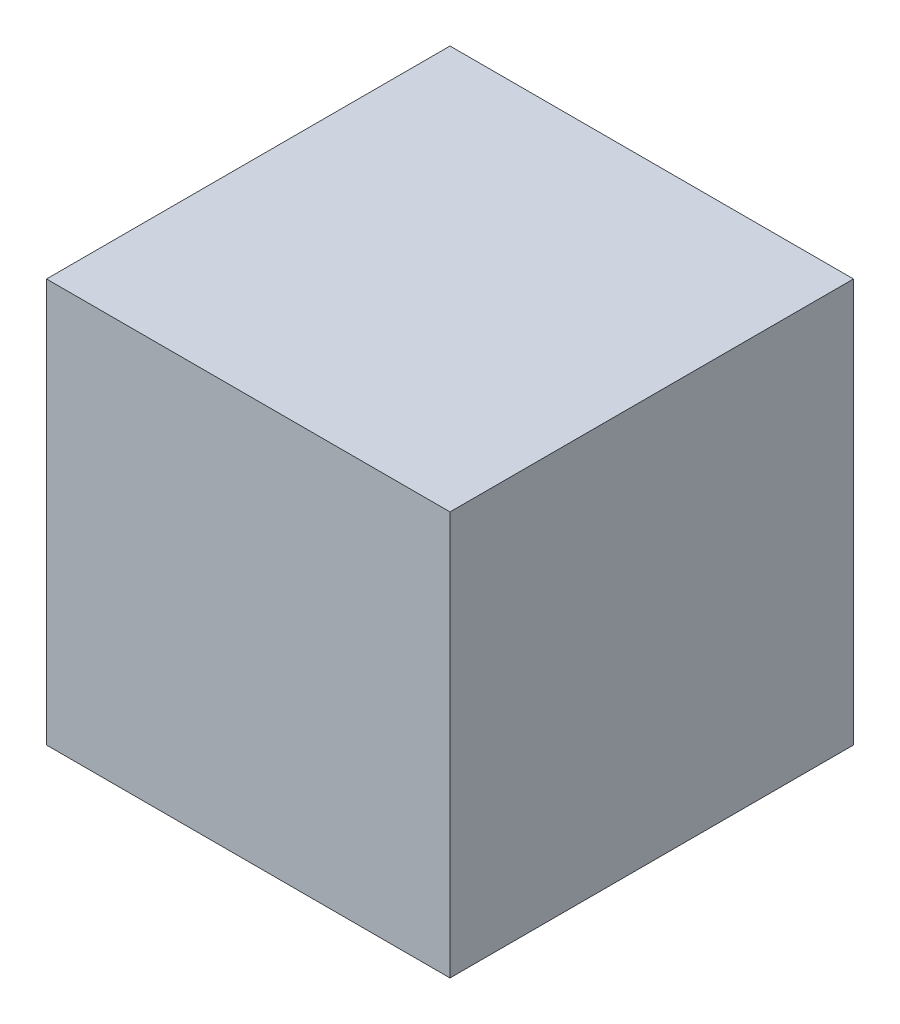
ISO-10303-21;
HEADER;
FILE_DESCRIPTION(('STEP AP214'),'2;1');
FILE_NAME('part.step','',(''),(''),'','','');
FILE_SCHEMA(('AUTOMOTIVE_DESIGN { 1 0 10303 214 1 1 1 1 }'));
ENDSEC;
DATA;
#1=APPLICATION_CONTEXT('core data for automotive mechanical design processes');
#2=APPLICATION_PROTOCOL_DEFINITION('international standard','automotive_design',2000,#1);
#3=PRODUCT_CONTEXT('',#1,'mechanical');
#4=PRODUCT('Part','Part','',(#3));
#5=PRODUCT_RELATED_PRODUCT_CATEGORY('part','',(#4));
#6=PRODUCT_DEFINITION_FORMATION('','',#4);
#7=PRODUCT_DEFINITION_CONTEXT('part definition',#1,'design');
#8=PRODUCT_DEFINITION('design','',#6,#7);
#9=PRODUCT_DEFINITION_SHAPE('','',#8);
#10=(LENGTH_UNIT() NAMED_UNIT(*) SI_UNIT(.MILLI.,.METRE.));
#11=(NAMED_UNIT(*) PLANE_ANGLE_UNIT() SI_UNIT($,.RADIAN.));
#12=(NAMED_UNIT(*) SI_UNIT($,.STERADIAN.) SOLID_ANGLE_UNIT());
#13=UNCERTAINTY_MEASURE_WITH_UNIT(LENGTH_MEASURE(1.E-05),#10,'distance_accuracy_value','');
#14=(GEOMETRIC_REPRESENTATION_CONTEXT(3) GLOBAL_UNCERTAINTY_ASSIGNED_CONTEXT((#13)) GLOBAL_UNIT_ASSIGNED_CONTEXT((#10,
#11,#12)) REPRESENTATION_CONTEXT('',''));
#15=CARTESIAN_POINT('',(0.,0.,0.));
#16=DIRECTION('',(0.,0.,1.));
#17=DIRECTION('',(1.,0.,0.));
#18=AXIS2_PLACEMENT_3D('',#15,#16,#17);
#19=CARTESIAN_POINT('',(127.1,254.,-127.1));
#20=DIRECTION('',(-1.,0.,0.));
#21=DIRECTION('',(0.,0.,1.));
#22=AXIS2_PLACEMENT_3D('',#19,#20,#21);
#23=PLANE('',#22);
#24=DIRECTION('',(0.,-1.,0.));
#25=VECTOR('',#24,1.);
#26=CARTESIAN_POINT('',(127.1,254.,127.));
#27=LINE('',#26,#25);
#28=CARTESIAN_POINT('',(127.1,254.1,127.));
#29=VERTEX_POINT('',#28);
#30=CARTESIAN_POINT('',(127.1,-0.1,127.));
#31=VERTEX_POINT('',#30);
#32=EDGE_CURVE('E11',#29,#31,#27,.T.);
#33=ORIENTED_EDGE('',*,*,#32,.T.);
#34=DIRECTION('',(0.,0.,1.));
#35=VECTOR('',#34,1.);
#36=CARTESIAN_POINT('',(127.1,-0.1,127.));
#37=LINE('',#36,#35);
#38=CARTESIAN_POINT('',(127.1,-0.1,-127.1));
#39=VERTEX_POINT('',#38);
#40=EDGE_CURVE('E129',#39,#31,#37,.T.);
#41=ORIENTED_EDGE('',*,*,#40,.F.);
#42=DIRECTION('',(0.,-1.,0.));
#43=VECTOR('',#42,1.);
#44=CARTESIAN_POINT('',(127.1,254.,-127.1));
#45=LINE('',#44,#43);
#46=CARTESIAN_POINT('',(127.1,254.1,-127.1));
#47=VERTEX_POINT('',#46);
#48=EDGE_CURVE('E44',#47,#39,#45,.T.);
#49=ORIENTED_EDGE('',*,*,#48,.F.);
#50=DIRECTION('',(0.,0.,-1.));
#51=VECTOR('',#50,1.);
#52=CARTESIAN_POINT('',(127.1,254.1,-127.1));
#53=LINE('',#52,#51);
#54=EDGE_CURVE('E143',#29,#47,#53,.T.);
#55=ORIENTED_EDGE('',*,*,#54,.F.);
#56=EDGE_LOOP('',(#33,#41,#49,#55));
#57=FACE_BOUND('',#56,.T.);
#58=ADVANCED_FACE('F36',(#57),#23,.F.);
#59=CARTESIAN_POINT('',(-127.,254.,-127.1));
#60=DIRECTION('',(0.,0.,1.));
#61=DIRECTION('',(1.,0.,0.));
#62=AXIS2_PLACEMENT_3D('',#59,#60,#61);
#63=PLANE('',#62);
#64=ORIENTED_EDGE('',*,*,#48,.T.);
#65=DIRECTION('',(1.,0.,0.));
#66=VECTOR('',#65,1.);
#67=CARTESIAN_POINT('',(-127.,-0.1,-127.1));
#68=LINE('',#67,#66);
#69=CARTESIAN_POINT('',(-127.,-0.1,-127.1));
#70=VERTEX_POINT('',#69);
#71=EDGE_CURVE('E124',#70,#39,#68,.T.);
#72=ORIENTED_EDGE('',*,*,#71,.F.);
#73=DIRECTION('',(0.,-1.,0.));
#74=VECTOR('',#73,1.);
#75=CARTESIAN_POINT('',(-127.,254.,-127.1));
#76=LINE('',#75,#74);
#77=CARTESIAN_POINT('',(-127.,254.1,-127.1));
#78=VERTEX_POINT('',#77);
#79=EDGE_CURVE('E111',#78,#70,#76,.T.);
#80=ORIENTED_EDGE('',*,*,#79,.F.);
#81=DIRECTION('',(-1.,0.,0.));
#82=VECTOR('',#81,1.);
#83=CARTESIAN_POINT('',(-127.,254.1,-127.1));
#84=LINE('',#83,#82);
#85=EDGE_CURVE('E146',#47,#78,#84,.T.);
#86=ORIENTED_EDGE('',*,*,#85,.F.);
#87=EDGE_LOOP('',(#64,#72,#80,#86));
#88=FACE_BOUND('',#87,.T.);
#89=ADVANCED_FACE('F125',(#88),#63,.F.);
#90=CARTESIAN_POINT('',(-127.,254.,-127.));
#91=DIRECTION('',(1.,0.,0.));
#92=DIRECTION('',(0.,0.,-1.));
#93=AXIS2_PLACEMENT_3D('',#90,#91,#92);
#94=PLANE('',#93);
#95=ORIENTED_EDGE('',*,*,#79,.T.);
#96=DIRECTION('',(0.,0.,-1.));
#97=VECTOR('',#96,1.);
#98=CARTESIAN_POINT('',(-127.,-0.1,127.));
#99=LINE('',#98,#97);
#100=CARTESIAN_POINT('',(-127.,-0.1,127.));
#101=VERTEX_POINT('',#100);
#102=EDGE_CURVE('E115',#101,#70,#99,.T.);
#103=ORIENTED_EDGE('',*,*,#102,.F.);
#104=DIRECTION('',(0.,-1.,0.));
#105=VECTOR('',#104,1.);
#106=CARTESIAN_POINT('',(-127.,254.,127.));
#107=LINE('',#106,#105);
#108=CARTESIAN_POINT('',(-127.,254.1,127.));
#109=VERTEX_POINT('',#108);
#110=EDGE_CURVE('E121',#109,#101,#107,.T.);
#111=ORIENTED_EDGE('',*,*,#110,.F.);
#112=DIRECTION('',(0.,0.,1.));
#113=VECTOR('',#112,1.);
#114=CARTESIAN_POINT('',(-127.,254.1,-127.1));
#115=LINE('',#114,#113);
#116=EDGE_CURVE('E117',#78,#109,#115,.T.);
#117=ORIENTED_EDGE('',*,*,#116,.F.);
#118=EDGE_LOOP('',(#95,#103,#111,#117));
#119=FACE_BOUND('',#118,.T.);
#120=ADVANCED_FACE('F113',(#119),#94,.F.);
#121=CARTESIAN_POINT('',(-127.,254.,127.));
#122=DIRECTION('',(0.,0.,-1.));
#123=DIRECTION('',(-1.,0.,0.));
#124=AXIS2_PLACEMENT_3D('',#121,#122,#123);
#125=PLANE('',#124);
#126=ORIENTED_EDGE('',*,*,#110,.T.);
#127=DIRECTION('',(-1.,0.,0.));
#128=VECTOR('',#127,1.);
#129=CARTESIAN_POINT('',(-127.,-0.1,127.));
#130=LINE('',#129,#128);
#131=EDGE_CURVE('E134',#31,#101,#130,.T.);
#132=ORIENTED_EDGE('',*,*,#131,.F.);
#133=ORIENTED_EDGE('',*,*,#32,.F.);
#134=DIRECTION('',(1.,0.,0.));
#135=VECTOR('',#134,1.);
#136=CARTESIAN_POINT('',(-127.,254.1,127.));
#137=LINE('',#136,#135);
#138=EDGE_CURVE('E140',#109,#29,#137,.T.);
#139=ORIENTED_EDGE('',*,*,#138,.F.);
#140=EDGE_LOOP('',(#126,#132,#133,#139));
#141=FACE_BOUND('',#140,.T.);
#142=ADVANCED_FACE('F172',(#141),#125,.F.);
#143=CARTESIAN_POINT('',(0.,254.1,0.));
#144=DIRECTION('',(0.,1.,0.));
#145=DIRECTION('',(0.,0.,1.));
#146=AXIS2_PLACEMENT_3D('',#143,#144,#145);
#147=PLANE('',#146);
#148=ORIENTED_EDGE('',*,*,#116,.T.);
#149=ORIENTED_EDGE('',*,*,#138,.T.);
#150=ORIENTED_EDGE('',*,*,#54,.T.);
#151=ORIENTED_EDGE('',*,*,#85,.T.);
#152=EDGE_LOOP('',(#148,#149,#150,#151));
#153=FACE_BOUND('',#152,.T.);
#154=ADVANCED_FACE('F175',(#153),#147,.T.);
#155=CARTESIAN_POINT('',(0.,-0.1,0.));
#156=DIRECTION('',(0.,-1.,0.));
#157=DIRECTION('',(0.,0.,-1.));
#158=AXIS2_PLACEMENT_3D('',#155,#156,#157);
#159=PLANE('',#158);
#160=ORIENTED_EDGE('',*,*,#102,.T.);
#161=ORIENTED_EDGE('',*,*,#71,.T.);
#162=ORIENTED_EDGE('',*,*,#40,.T.);
#163=ORIENTED_EDGE('',*,*,#131,.T.);
#164=EDGE_LOOP('',(#160,#161,#162,#163));
#165=FACE_BOUND('',#164,.T.);
#166=ADVANCED_FACE('F132',(#165),#159,.T.);
#167=CLOSED_SHELL('',(#58,#89,#120,#142,#154,#166));
#168=CARTESIAN_POINT('',(0.,0.,0.));
#169=DIRECTION('',(0.,-1.,0.));
#170=DIRECTION('',(0.,0.,-1.));
#171=AXIS2_PLACEMENT_3D('',#168,#169,#170);
#172=PLANE('',#171);
#173=DIRECTION('',(0.,0.,1.));
#174=VECTOR('',#173,1.);
#175=CARTESIAN_POINT('',(-126.9,0.,-127.));
#176=LINE('',#175,#174);
#177=CARTESIAN_POINT('',(-126.9,0.,-127.));
#178=VERTEX_POINT('',#177);
#179=CARTESIAN_POINT('',(-126.9,0.,126.9));
#180=VERTEX_POINT('',#179);
#181=EDGE_CURVE('E157',#178,#180,#176,.T.);
#182=ORIENTED_EDGE('',*,*,#181,.T.);
#183=DIRECTION('',(1.,0.,0.));
#184=VECTOR('',#183,1.);
#185=CARTESIAN_POINT('',(-126.9,0.,126.9));
#186=LINE('',#185,#184);
#187=CARTESIAN_POINT('',(127.,0.,126.9));
#188=VERTEX_POINT('',#187);
#189=EDGE_CURVE('E150',#180,#188,#186,.T.);
#190=ORIENTED_EDGE('',*,*,#189,.T.);
#191=DIRECTION('',(0.,0.,-1.));
#192=VECTOR('',#191,1.);
#193=CARTESIAN_POINT('',(127.,0.,-127.));
#194=LINE('',#193,#192);
#195=CARTESIAN_POINT('',(127.,0.,-127.));
#196=VERTEX_POINT('',#195);
#197=EDGE_CURVE('E51',#188,#196,#194,.T.);
#198=ORIENTED_EDGE('',*,*,#197,.T.);
#199=DIRECTION('',(-1.,0.,0.));
#200=VECTOR('',#199,1.);
#201=CARTESIAN_POINT('',(-126.9,0.,-127.));
#202=LINE('',#201,#200);
#203=EDGE_CURVE('E72',#196,#178,#202,.T.);
#204=ORIENTED_EDGE('',*,*,#203,.T.);
#205=EDGE_LOOP('',(#182,#190,#198,#204));
#206=FACE_BOUND('',#205,.T.);
#207=ADVANCED_FACE('F206',(#206),#172,.F.);
#208=CARTESIAN_POINT('',(0.,254.,0.));
#209=DIRECTION('',(0.,1.,0.));
#210=DIRECTION('',(0.,0.,1.));
#211=AXIS2_PLACEMENT_3D('',#208,#209,#210);
#212=PLANE('',#211);
#213=DIRECTION('',(0.,0.,-1.));
#214=VECTOR('',#213,1.);
#215=CARTESIAN_POINT('',(127.,254.,-127.));
#216=LINE('',#215,#214);
#217=CARTESIAN_POINT('',(127.,254.,126.9));
#218=VERTEX_POINT('',#217);
#219=CARTESIAN_POINT('',(127.,254.,-127.));
#220=VERTEX_POINT('',#219);
#221=EDGE_CURVE('E76',#218,#220,#216,.T.);
#222=ORIENTED_EDGE('',*,*,#221,.F.);
#223=DIRECTION('',(1.,0.,0.));
#224=VECTOR('',#223,1.);
#225=CARTESIAN_POINT('',(-126.9,254.,126.9));
#226=LINE('',#225,#224);
#227=CARTESIAN_POINT('',(-126.9,254.,126.9));
#228=VERTEX_POINT('',#227);
#229=EDGE_CURVE('E79',#228,#218,#226,.T.);
#230=ORIENTED_EDGE('',*,*,#229,.F.);
#231=DIRECTION('',(0.,0.,1.));
#232=VECTOR('',#231,1.);
#233=CARTESIAN_POINT('',(-126.9,254.,-127.));
#234=LINE('',#233,#232);
#235=CARTESIAN_POINT('',(-126.9,254.,-127.));
#236=VERTEX_POINT('',#235);
#237=EDGE_CURVE('E60',#236,#228,#234,.T.);
#238=ORIENTED_EDGE('',*,*,#237,.F.);
#239=DIRECTION('',(-1.,0.,0.));
#240=VECTOR('',#239,1.);
#241=CARTESIAN_POINT('',(-126.9,254.,-127.));
#242=LINE('',#241,#240);
#243=EDGE_CURVE('E149',#220,#236,#242,.T.);
#244=ORIENTED_EDGE('',*,*,#243,.F.);
#245=EDGE_LOOP('',(#222,#230,#238,#244));
#246=FACE_BOUND('',#245,.T.);
#247=ADVANCED_FACE('F199',(#246),#212,.F.);
#248=CARTESIAN_POINT('',(-126.9,254.,-127.));
#249=DIRECTION('',(1.,0.,0.));
#250=DIRECTION('',(0.,0.,-1.));
#251=AXIS2_PLACEMENT_3D('',#248,#249,#250);
#252=PLANE('',#251);
#253=ORIENTED_EDGE('',*,*,#181,.F.);
#254=DIRECTION('',(0.,-1.,0.));
#255=VECTOR('',#254,1.);
#256=CARTESIAN_POINT('',(-126.9,254.,-127.));
#257=LINE('',#256,#255);
#258=EDGE_CURVE('E166',#236,#178,#257,.T.);
#259=ORIENTED_EDGE('',*,*,#258,.F.);
#260=ORIENTED_EDGE('',*,*,#237,.T.);
#261=DIRECTION('',(0.,-1.,0.));
#262=VECTOR('',#261,1.);
#263=CARTESIAN_POINT('',(-126.9,254.,126.9));
#264=LINE('',#263,#262);
#265=EDGE_CURVE('E163',#228,#180,#264,.T.);
#266=ORIENTED_EDGE('',*,*,#265,.T.);
#267=EDGE_LOOP('',(#253,#259,#260,#266));
#268=FACE_BOUND('',#267,.T.);
#269=ADVANCED_FACE('F196',(#268),#252,.T.);
#270=CARTESIAN_POINT('',(-126.9,254.,-127.));
#271=DIRECTION('',(0.,0.,1.));
#272=DIRECTION('',(1.,0.,0.));
#273=AXIS2_PLACEMENT_3D('',#270,#271,#272);
#274=PLANE('',#273);
#275=ORIENTED_EDGE('',*,*,#203,.F.);
#276=DIRECTION('',(0.,-1.,0.));
#277=VECTOR('',#276,1.);
#278=CARTESIAN_POINT('',(127.,254.,-127.));
#279=LINE('',#278,#277);
#280=EDGE_CURVE('E168',#220,#196,#279,.T.);
#281=ORIENTED_EDGE('',*,*,#280,.F.);
#282=ORIENTED_EDGE('',*,*,#243,.T.);
#283=ORIENTED_EDGE('',*,*,#258,.T.);
#284=EDGE_LOOP('',(#275,#281,#282,#283));
#285=FACE_BOUND('',#284,.T.);
#286=ADVANCED_FACE('F192',(#285),#274,.T.);
#287=CARTESIAN_POINT('',(127.,254.,-127.));
#288=DIRECTION('',(-1.,0.,0.));
#289=DIRECTION('',(0.,0.,1.));
#290=AXIS2_PLACEMENT_3D('',#287,#288,#289);
#291=PLANE('',#290);
#292=ORIENTED_EDGE('',*,*,#197,.F.);
#293=DIRECTION('',(0.,-1.,0.));
#294=VECTOR('',#293,1.);
#295=CARTESIAN_POINT('',(127.,254.,126.9));
#296=LINE('',#295,#294);
#297=EDGE_CURVE('E154',#218,#188,#296,.T.);
#298=ORIENTED_EDGE('',*,*,#297,.F.);
#299=ORIENTED_EDGE('',*,*,#221,.T.);
#300=ORIENTED_EDGE('',*,*,#280,.T.);
#301=EDGE_LOOP('',(#292,#298,#299,#300));
#302=FACE_BOUND('',#301,.T.);
#303=ADVANCED_FACE('F188',(#302),#291,.T.);
#304=CARTESIAN_POINT('',(-126.9,254.,126.9));
#305=DIRECTION('',(0.,0.,-1.));
#306=DIRECTION('',(-1.,0.,0.));
#307=AXIS2_PLACEMENT_3D('',#304,#305,#306);
#308=PLANE('',#307);
#309=ORIENTED_EDGE('',*,*,#189,.F.);
#310=ORIENTED_EDGE('',*,*,#265,.F.);
#311=ORIENTED_EDGE('',*,*,#229,.T.);
#312=ORIENTED_EDGE('',*,*,#297,.T.);
#313=EDGE_LOOP('',(#309,#310,#311,#312));
#314=FACE_BOUND('',#313,.T.);
#315=ADVANCED_FACE('F191',(#314),#308,.T.);
#316=CLOSED_SHELL('',(#207,#247,#269,#286,#303,#315));
#317=ORIENTED_CLOSED_SHELL('',*,#316,.T.);
#318=BREP_WITH_VOIDS('B2',#167,(#317));
#319=ADVANCED_BREP_SHAPE_REPRESENTATION('',(#18,#318),#14);
#320=SHAPE_DEFINITION_REPRESENTATION(#9,#319);
ENDSEC;
END-ISO-10303-21;
